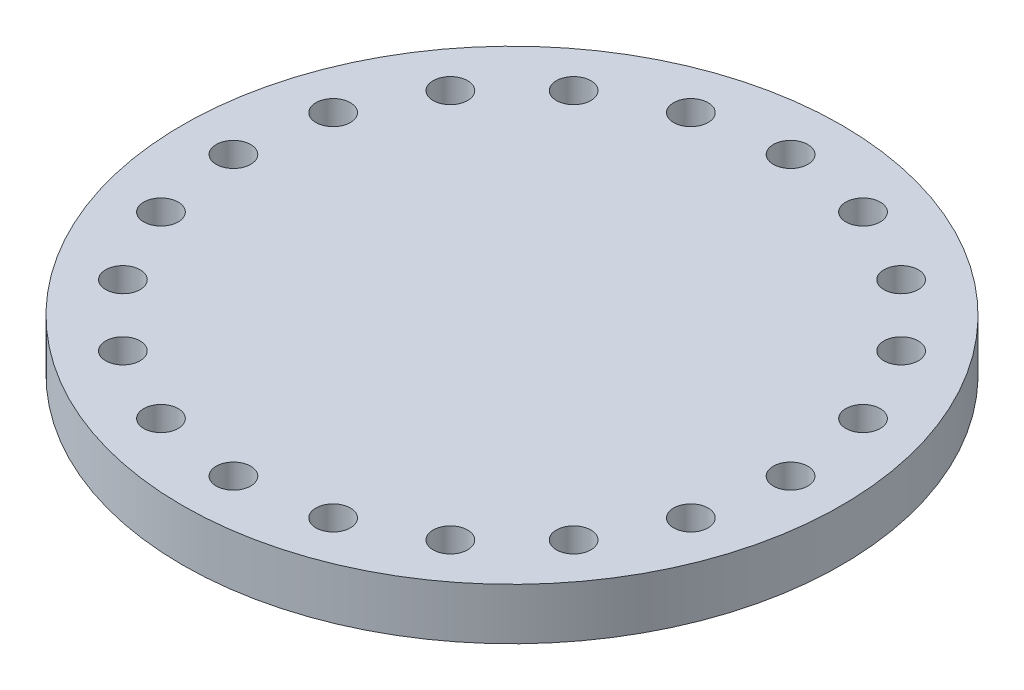
ISO-10303-21;
HEADER;
FILE_DESCRIPTION(('STEP AP214'),'2;1');
FILE_NAME('part.step','',(''),(''),'','','');
FILE_SCHEMA(('AUTOMOTIVE_DESIGN { 1 0 10303 214 1 1 1 1 }'));
ENDSEC;
DATA;
#1=APPLICATION_CONTEXT('core data for automotive mechanical design processes');
#2=APPLICATION_PROTOCOL_DEFINITION('international standard','automotive_design',2000,#1);
#3=PRODUCT_CONTEXT('',#1,'mechanical');
#4=PRODUCT('Part','Part','',(#3));
#5=PRODUCT_RELATED_PRODUCT_CATEGORY('part','',(#4));
#6=PRODUCT_DEFINITION_FORMATION('','',#4);
#7=PRODUCT_DEFINITION_CONTEXT('part definition',#1,'design');
#8=PRODUCT_DEFINITION('design','',#6,#7);
#9=PRODUCT_DEFINITION_SHAPE('','',#8);
#10=(LENGTH_UNIT() NAMED_UNIT(*) SI_UNIT(.MILLI.,.METRE.));
#11=(NAMED_UNIT(*) PLANE_ANGLE_UNIT() SI_UNIT($,.RADIAN.));
#12=(NAMED_UNIT(*) SI_UNIT($,.STERADIAN.) SOLID_ANGLE_UNIT());
#13=UNCERTAINTY_MEASURE_WITH_UNIT(LENGTH_MEASURE(1.E-05),#10,'distance_accuracy_value','');
#14=(GEOMETRIC_REPRESENTATION_CONTEXT(3) GLOBAL_UNCERTAINTY_ASSIGNED_CONTEXT((#13)) GLOBAL_UNIT_ASSIGNED_CONTEXT((#10,
#11,#12)) REPRESENTATION_CONTEXT('',''));
#15=CARTESIAN_POINT('',(0.,0.,0.));
#16=DIRECTION('',(0.,0.,1.));
#17=DIRECTION('',(1.,0.,0.));
#18=AXIS2_PLACEMENT_3D('',#15,#16,#17);
#19=CARTESIAN_POINT('',(0.,5.,0.));
#20=DIRECTION('',(0.,1.,0.));
#21=DIRECTION('',(0.,0.,1.));
#22=AXIS2_PLACEMENT_3D('',#19,#20,#21);
#23=PLANE('',#22);
#24=CARTESIAN_POINT('',(15.8995910745112,5.,21.8839096978426));
#25=DIRECTION('',(0.,1.,0.));
#26=DIRECTION('',(0.,0.,1.));
#27=AXIS2_PLACEMENT_3D('',#24,#25,#26);
#28=CIRCLE('',#27,1.67500000000001);
#29=CARTESIAN_POINT('',(15.8995910745112,5.,23.5589096978426));
#30=VERTEX_POINT('',#29);
#31=EDGE_CURVE('E198',#30,#30,#28,.T.);
#32=ORIENTED_EDGE('',*,*,#31,.F.);
#33=EDGE_LOOP('',(#32));
#34=FACE_BOUND('',#33,.T.);
#35=CARTESIAN_POINT('',(25.7260787657839,5.,8.35890969784265));
#36=DIRECTION('',(0.,1.,0.));
#37=DIRECTION('',(0.,0.,1.));
#38=AXIS2_PLACEMENT_3D('',#35,#36,#37);
#39=CIRCLE('',#38,1.67500000000001);
#40=CARTESIAN_POINT('',(25.7260787657839,5.,10.0339096978427));
#41=VERTEX_POINT('',#40);
#42=EDGE_CURVE('E182',#41,#41,#39,.T.);
#43=ORIENTED_EDGE('',*,*,#42,.F.);
#44=EDGE_LOOP('',(#43));
#45=FACE_BOUND('',#44,.T.);
#46=CARTESIAN_POINT('',(25.7260787657841,5.,-8.35890969784211));
#47=DIRECTION('',(0.,1.,0.));
#48=DIRECTION('',(0.,0.,1.));
#49=AXIS2_PLACEMENT_3D('',#46,#47,#48);
#50=CIRCLE('',#49,1.67500000000001);
#51=CARTESIAN_POINT('',(25.7260787657841,5.,-6.6839096978421));
#52=VERTEX_POINT('',#51);
#53=EDGE_CURVE('E166',#52,#52,#50,.T.);
#54=ORIENTED_EDGE('',*,*,#53,.F.);
#55=EDGE_LOOP('',(#54));
#56=FACE_BOUND('',#55,.T.);
#57=CARTESIAN_POINT('',(15.8995910745117,5.,-21.8839096978423));
#58=DIRECTION('',(0.,1.,0.));
#59=DIRECTION('',(0.,0.,1.));
#60=AXIS2_PLACEMENT_3D('',#57,#58,#59);
#61=CIRCLE('',#60,1.67500000000001);
#62=CARTESIAN_POINT('',(15.8995910745117,5.,-20.2089096978423));
#63=VERTEX_POINT('',#62);
#64=EDGE_CURVE('E150',#63,#63,#61,.T.);
#65=ORIENTED_EDGE('',*,*,#64,.F.);
#66=EDGE_LOOP('',(#65));
#67=FACE_BOUND('',#66,.T.);
#68=CARTESIAN_POINT('',(1.88889140431414E-13,5.,-27.0500000000001));
#69=DIRECTION('',(0.,1.,0.));
#70=DIRECTION('',(0.,0.,1.));
#71=AXIS2_PLACEMENT_3D('',#68,#69,#70);
#72=CIRCLE('',#71,1.67500000000001);
#73=CARTESIAN_POINT('',(1.88889140431414E-13,5.,-25.3750000000001));
#74=VERTEX_POINT('',#73);
#75=EDGE_CURVE('E134',#74,#74,#72,.T.);
#76=ORIENTED_EDGE('',*,*,#75,.F.);
#77=EDGE_LOOP('',(#76));
#78=FACE_BOUND('',#77,.T.);
#79=CARTESIAN_POINT('',(-15.8995910745113,5.,-21.8839096978425));
#80=DIRECTION('',(0.,1.,0.));
#81=DIRECTION('',(0.,0.,1.));
#82=AXIS2_PLACEMENT_3D('',#79,#80,#81);
#83=CIRCLE('',#82,1.67500000000001);
#84=CARTESIAN_POINT('',(-15.8995910745113,5.,-20.2089096978425));
#85=VERTEX_POINT('',#84);
#86=EDGE_CURVE('E118',#85,#85,#83,.T.);
#87=ORIENTED_EDGE('',*,*,#86,.F.);
#88=EDGE_LOOP('',(#87));
#89=FACE_BOUND('',#88,.T.);
#90=CARTESIAN_POINT('',(-25.726078765784,5.,-8.35890969784247));
#91=DIRECTION('',(0.,1.,0.));
#92=DIRECTION('',(0.,0.,1.));
#93=AXIS2_PLACEMENT_3D('',#90,#91,#92);
#94=CIRCLE('',#93,1.67500000000001);
#95=CARTESIAN_POINT('',(-25.726078765784,5.,-6.68390969784246));
#96=VERTEX_POINT('',#95);
#97=EDGE_CURVE('E102',#96,#96,#94,.T.);
#98=ORIENTED_EDGE('',*,*,#97,.F.);
#99=EDGE_LOOP('',(#98));
#100=FACE_BOUND('',#99,.T.);
#101=CARTESIAN_POINT('',(0.,5.,27.0500000000001));
#102=DIRECTION('',(0.,1.,0.));
#103=DIRECTION('',(0.,0.,1.));
#104=AXIS2_PLACEMENT_3D('',#101,#102,#103);
#105=CIRCLE('',#104,1.67500000000001);
#106=CARTESIAN_POINT('',(0.,5.,28.7250000000001));
#107=VERTEX_POINT('',#106);
#108=EDGE_CURVE('E86',#107,#107,#105,.T.);
#109=ORIENTED_EDGE('',*,*,#108,.F.);
#110=EDGE_LOOP('',(#109));
#111=FACE_BOUND('',#110,.T.);
#112=CARTESIAN_POINT('',(-21.8839096978424,5.,15.8995910745114));
#113=DIRECTION('',(0.,1.,0.));
#114=DIRECTION('',(0.,0.,1.));
#115=AXIS2_PLACEMENT_3D('',#112,#113,#114);
#116=CIRCLE('',#115,1.67500000000002);
#117=CARTESIAN_POINT('',(-21.8839096978424,5.,17.5745910745114));
#118=VERTEX_POINT('',#117);
#119=EDGE_CURVE('E70',#118,#118,#116,.T.);
#120=ORIENTED_EDGE('',*,*,#119,.F.);
#121=EDGE_LOOP('',(#120));
#122=FACE_BOUND('',#121,.T.);
#123=CARTESIAN_POINT('',(-8.35890969784238,5.,25.726078765784));
#124=DIRECTION('',(0.,1.,0.));
#125=DIRECTION('',(0.,0.,1.));
#126=AXIS2_PLACEMENT_3D('',#123,#124,#125);
#127=CIRCLE('',#126,1.67500000000001);
#128=CARTESIAN_POINT('',(-8.35890969784238,5.,27.401078765784));
#129=VERTEX_POINT('',#128);
#130=EDGE_CURVE('E56',#129,#129,#127,.T.);
#131=ORIENTED_EDGE('',*,*,#130,.F.);
#132=EDGE_LOOP('',(#131));
#133=FACE_BOUND('',#132,.T.);
#134=CARTESIAN_POINT('',(0.,5.,0.));
#135=DIRECTION('',(0.,1.,0.));
#136=DIRECTION('',(0.,0.,1.));
#137=AXIS2_PLACEMENT_3D('',#134,#135,#136);
#138=CIRCLE('',#137,32.);
#139=CARTESIAN_POINT('',(0.,5.,32.));
#140=VERTEX_POINT('',#139);
#141=EDGE_CURVE('E10',#140,#140,#138,.T.);
#142=ORIENTED_EDGE('',*,*,#141,.T.);
#143=EDGE_LOOP('',(#142));
#144=FACE_BOUND('',#143,.T.);
#145=CARTESIAN_POINT('',(-15.8995910745115,5.,21.8839096978424));
#146=DIRECTION('',(0.,1.,0.));
#147=DIRECTION('',(0.,0.,1.));
#148=AXIS2_PLACEMENT_3D('',#145,#146,#147);
#149=CIRCLE('',#148,1.67500000000001);
#150=CARTESIAN_POINT('',(-15.8995910745115,5.,23.5589096978424));
#151=VERTEX_POINT('',#150);
#152=EDGE_CURVE('E62',#151,#151,#149,.T.);
#153=ORIENTED_EDGE('',*,*,#152,.F.);
#154=EDGE_LOOP('',(#153));
#155=FACE_BOUND('',#154,.T.);
#156=CARTESIAN_POINT('',(-25.726078765784,5.,8.35890969784229));
#157=DIRECTION('',(0.,1.,0.));
#158=DIRECTION('',(0.,0.,1.));
#159=AXIS2_PLACEMENT_3D('',#156,#157,#158);
#160=CIRCLE('',#159,1.67500000000001);
#161=CARTESIAN_POINT('',(-25.726078765784,5.,10.0339096978423));
#162=VERTEX_POINT('',#161);
#163=EDGE_CURVE('E78',#162,#162,#160,.T.);
#164=ORIENTED_EDGE('',*,*,#163,.F.);
#165=EDGE_LOOP('',(#164));
#166=FACE_BOUND('',#165,.T.);
#167=CARTESIAN_POINT('',(-27.0500000000001,5.,0.));
#168=DIRECTION('',(0.,1.,0.));
#169=DIRECTION('',(0.,0.,1.));
#170=AXIS2_PLACEMENT_3D('',#167,#168,#169);
#171=CIRCLE('',#170,1.67500000000001);
#172=CARTESIAN_POINT('',(-27.0500000000001,5.,1.67499999999992));
#173=VERTEX_POINT('',#172);
#174=EDGE_CURVE('E94',#173,#173,#171,.T.);
#175=ORIENTED_EDGE('',*,*,#174,.F.);
#176=EDGE_LOOP('',(#175));
#177=FACE_BOUND('',#176,.T.);
#178=CARTESIAN_POINT('',(-21.8839096978423,5.,-15.8995910745116));
#179=DIRECTION('',(0.,1.,0.));
#180=DIRECTION('',(0.,0.,1.));
#181=AXIS2_PLACEMENT_3D('',#178,#179,#180);
#182=CIRCLE('',#181,1.67500000000001);
#183=CARTESIAN_POINT('',(-21.8839096978423,5.,-14.2245910745115));
#184=VERTEX_POINT('',#183);
#185=EDGE_CURVE('E110',#184,#184,#182,.T.);
#186=ORIENTED_EDGE('',*,*,#185,.F.);
#187=EDGE_LOOP('',(#186));
#188=FACE_BOUND('',#187,.T.);
#189=CARTESIAN_POINT('',(-8.35890969784219,5.,-25.726078765784));
#190=DIRECTION('',(0.,1.,0.));
#191=DIRECTION('',(0.,0.,1.));
#192=AXIS2_PLACEMENT_3D('',#189,#190,#191);
#193=CIRCLE('',#192,1.67500000000001);
#194=CARTESIAN_POINT('',(-8.35890969784219,5.,-24.051078765784));
#195=VERTEX_POINT('',#194);
#196=EDGE_CURVE('E126',#195,#195,#193,.T.);
#197=ORIENTED_EDGE('',*,*,#196,.F.);
#198=EDGE_LOOP('',(#197));
#199=FACE_BOUND('',#198,.T.);
#200=CARTESIAN_POINT('',(8.35890969784256,5.,-25.7260787657839));
#201=DIRECTION('',(0.,1.,0.));
#202=DIRECTION('',(0.,0.,1.));
#203=AXIS2_PLACEMENT_3D('',#200,#201,#202);
#204=CIRCLE('',#203,1.67500000000001);
#205=CARTESIAN_POINT('',(8.35890969784256,5.,-24.0510787657839));
#206=VERTEX_POINT('',#205);
#207=EDGE_CURVE('E142',#206,#206,#204,.T.);
#208=ORIENTED_EDGE('',*,*,#207,.F.);
#209=EDGE_LOOP('',(#208));
#210=FACE_BOUND('',#209,.T.);
#211=CARTESIAN_POINT('',(21.8839096978426,5.,-15.8995910745112));
#212=DIRECTION('',(0.,1.,0.));
#213=DIRECTION('',(0.,0.,1.));
#214=AXIS2_PLACEMENT_3D('',#211,#212,#213);
#215=CIRCLE('',#214,1.67500000000001);
#216=CARTESIAN_POINT('',(21.8839096978426,5.,-14.2245910745112));
#217=VERTEX_POINT('',#216);
#218=EDGE_CURVE('E158',#217,#217,#215,.T.);
#219=ORIENTED_EDGE('',*,*,#218,.F.);
#220=EDGE_LOOP('',(#219));
#221=FACE_BOUND('',#220,.T.);
#222=CARTESIAN_POINT('',(27.0500000000001,5.,2.83333710647121E-13));
#223=DIRECTION('',(0.,1.,0.));
#224=DIRECTION('',(0.,0.,1.));
#225=AXIS2_PLACEMENT_3D('',#222,#223,#224);
#226=CIRCLE('',#225,1.67500000000001);
#227=CARTESIAN_POINT('',(27.0500000000001,5.,1.67500000000029));
#228=VERTEX_POINT('',#227);
#229=EDGE_CURVE('E174',#228,#228,#226,.T.);
#230=ORIENTED_EDGE('',*,*,#229,.F.);
#231=EDGE_LOOP('',(#230));
#232=FACE_BOUND('',#231,.T.);
#233=CARTESIAN_POINT('',(21.8839096978422,5.,15.8995910745117));
#234=DIRECTION('',(0.,1.,0.));
#235=DIRECTION('',(0.,0.,1.));
#236=AXIS2_PLACEMENT_3D('',#233,#234,#235);
#237=CIRCLE('',#236,1.67500000000001);
#238=CARTESIAN_POINT('',(21.8839096978422,5.,17.5745910745117));
#239=VERTEX_POINT('',#238);
#240=EDGE_CURVE('E190',#239,#239,#237,.T.);
#241=ORIENTED_EDGE('',*,*,#240,.F.);
#242=EDGE_LOOP('',(#241));
#243=FACE_BOUND('',#242,.T.);
#244=CARTESIAN_POINT('',(8.35890969784202,5.,25.7260787657841));
#245=DIRECTION('',(0.,1.,0.));
#246=DIRECTION('',(0.,0.,1.));
#247=AXIS2_PLACEMENT_3D('',#244,#245,#246);
#248=CIRCLE('',#247,1.67500000000001);
#249=CARTESIAN_POINT('',(8.35890969784202,5.,27.4010787657841));
#250=VERTEX_POINT('',#249);
#251=EDGE_CURVE('E206',#250,#250,#248,.T.);
#252=ORIENTED_EDGE('',*,*,#251,.F.);
#253=EDGE_LOOP('',(#252));
#254=FACE_BOUND('',#253,.T.);
#255=ADVANCED_FACE('F43',(#34,#45,#56,#67,#78,#89,#100,#111,#122,#133,#144,#155,#166,#177,#188,
#199,#210,#221,#232,#243,#254),#23,.T.);
#256=CARTESIAN_POINT('',(0.,0.,0.));
#257=DIRECTION('',(0.,1.,0.));
#258=DIRECTION('',(0.,0.,1.));
#259=AXIS2_PLACEMENT_3D('',#256,#257,#258);
#260=PLANE('',#259);
#261=CARTESIAN_POINT('',(0.,0.,0.));
#262=DIRECTION('',(0.,1.,0.));
#263=DIRECTION('',(0.,0.,1.));
#264=AXIS2_PLACEMENT_3D('',#261,#262,#263);
#265=CIRCLE('',#264,32.);
#266=CARTESIAN_POINT('',(0.,0.,32.));
#267=VERTEX_POINT('',#266);
#268=EDGE_CURVE('E47',#267,#267,#265,.T.);
#269=ORIENTED_EDGE('',*,*,#268,.F.);
#270=EDGE_LOOP('',(#269));
#271=FACE_BOUND('',#270,.T.);
#272=CARTESIAN_POINT('',(-8.35890969784238,0.,25.726078765784));
#273=DIRECTION('',(0.,1.,0.));
#274=DIRECTION('',(0.,0.,1.));
#275=AXIS2_PLACEMENT_3D('',#272,#273,#274);
#276=CIRCLE('',#275,1.67500000000001);
#277=CARTESIAN_POINT('',(-8.35890969784238,0.,27.401078765784));
#278=VERTEX_POINT('',#277);
#279=EDGE_CURVE('E58',#278,#278,#276,.T.);
#280=ORIENTED_EDGE('',*,*,#279,.T.);
#281=EDGE_LOOP('',(#280));
#282=FACE_BOUND('',#281,.T.);
#283=CARTESIAN_POINT('',(-15.8995910745115,0.,21.8839096978424));
#284=DIRECTION('',(0.,1.,0.));
#285=DIRECTION('',(0.,0.,1.));
#286=AXIS2_PLACEMENT_3D('',#283,#284,#285);
#287=CIRCLE('',#286,1.67500000000001);
#288=CARTESIAN_POINT('',(-15.8995910745115,0.,23.5589096978424));
#289=VERTEX_POINT('',#288);
#290=EDGE_CURVE('E66',#289,#289,#287,.T.);
#291=ORIENTED_EDGE('',*,*,#290,.T.);
#292=EDGE_LOOP('',(#291));
#293=FACE_BOUND('',#292,.T.);
#294=CARTESIAN_POINT('',(-21.8839096978424,0.,15.8995910745114));
#295=DIRECTION('',(0.,1.,0.));
#296=DIRECTION('',(0.,0.,1.));
#297=AXIS2_PLACEMENT_3D('',#294,#295,#296);
#298=CIRCLE('',#297,1.67500000000002);
#299=CARTESIAN_POINT('',(-21.8839096978424,0.,17.5745910745114));
#300=VERTEX_POINT('',#299);
#301=EDGE_CURVE('E74',#300,#300,#298,.T.);
#302=ORIENTED_EDGE('',*,*,#301,.T.);
#303=EDGE_LOOP('',(#302));
#304=FACE_BOUND('',#303,.T.);
#305=CARTESIAN_POINT('',(-25.726078765784,0.,8.35890969784229));
#306=DIRECTION('',(0.,1.,0.));
#307=DIRECTION('',(0.,0.,1.));
#308=AXIS2_PLACEMENT_3D('',#305,#306,#307);
#309=CIRCLE('',#308,1.67500000000001);
#310=CARTESIAN_POINT('',(-25.726078765784,0.,10.0339096978423));
#311=VERTEX_POINT('',#310);
#312=EDGE_CURVE('E82',#311,#311,#309,.T.);
#313=ORIENTED_EDGE('',*,*,#312,.T.);
#314=EDGE_LOOP('',(#313));
#315=FACE_BOUND('',#314,.T.);
#316=CARTESIAN_POINT('',(0.,0.,27.0500000000001));
#317=DIRECTION('',(0.,1.,0.));
#318=DIRECTION('',(0.,0.,1.));
#319=AXIS2_PLACEMENT_3D('',#316,#317,#318);
#320=CIRCLE('',#319,1.67500000000001);
#321=CARTESIAN_POINT('',(0.,0.,28.7250000000001));
#322=VERTEX_POINT('',#321);
#323=EDGE_CURVE('E90',#322,#322,#320,.T.);
#324=ORIENTED_EDGE('',*,*,#323,.T.);
#325=EDGE_LOOP('',(#324));
#326=FACE_BOUND('',#325,.T.);
#327=CARTESIAN_POINT('',(-27.0500000000001,0.,0.));
#328=DIRECTION('',(0.,1.,0.));
#329=DIRECTION('',(0.,0.,1.));
#330=AXIS2_PLACEMENT_3D('',#327,#328,#329);
#331=CIRCLE('',#330,1.67500000000001);
#332=CARTESIAN_POINT('',(-27.0500000000001,0.,1.67499999999992));
#333=VERTEX_POINT('',#332);
#334=EDGE_CURVE('E98',#333,#333,#331,.T.);
#335=ORIENTED_EDGE('',*,*,#334,.T.);
#336=EDGE_LOOP('',(#335));
#337=FACE_BOUND('',#336,.T.);
#338=CARTESIAN_POINT('',(-25.726078765784,0.,-8.35890969784247));
#339=DIRECTION('',(0.,1.,0.));
#340=DIRECTION('',(0.,0.,1.));
#341=AXIS2_PLACEMENT_3D('',#338,#339,#340);
#342=CIRCLE('',#341,1.67500000000001);
#343=CARTESIAN_POINT('',(-25.726078765784,0.,-6.68390969784246));
#344=VERTEX_POINT('',#343);
#345=EDGE_CURVE('E106',#344,#344,#342,.T.);
#346=ORIENTED_EDGE('',*,*,#345,.T.);
#347=EDGE_LOOP('',(#346));
#348=FACE_BOUND('',#347,.T.);
#349=CARTESIAN_POINT('',(-21.8839096978423,0.,-15.8995910745116));
#350=DIRECTION('',(0.,1.,0.));
#351=DIRECTION('',(0.,0.,1.));
#352=AXIS2_PLACEMENT_3D('',#349,#350,#351);
#353=CIRCLE('',#352,1.67500000000001);
#354=CARTESIAN_POINT('',(-21.8839096978423,0.,-14.2245910745115));
#355=VERTEX_POINT('',#354);
#356=EDGE_CURVE('E114',#355,#355,#353,.T.);
#357=ORIENTED_EDGE('',*,*,#356,.T.);
#358=EDGE_LOOP('',(#357));
#359=FACE_BOUND('',#358,.T.);
#360=CARTESIAN_POINT('',(-15.8995910745113,0.,-21.8839096978425));
#361=DIRECTION('',(0.,1.,0.));
#362=DIRECTION('',(0.,0.,1.));
#363=AXIS2_PLACEMENT_3D('',#360,#361,#362);
#364=CIRCLE('',#363,1.67500000000001);
#365=CARTESIAN_POINT('',(-15.8995910745113,0.,-20.2089096978425));
#366=VERTEX_POINT('',#365);
#367=EDGE_CURVE('E122',#366,#366,#364,.T.);
#368=ORIENTED_EDGE('',*,*,#367,.T.);
#369=EDGE_LOOP('',(#368));
#370=FACE_BOUND('',#369,.T.);
#371=CARTESIAN_POINT('',(-8.35890969784219,0.,-25.726078765784));
#372=DIRECTION('',(0.,1.,0.));
#373=DIRECTION('',(0.,0.,1.));
#374=AXIS2_PLACEMENT_3D('',#371,#372,#373);
#375=CIRCLE('',#374,1.67500000000001);
#376=CARTESIAN_POINT('',(-8.35890969784219,0.,-24.051078765784));
#377=VERTEX_POINT('',#376);
#378=EDGE_CURVE('E130',#377,#377,#375,.T.);
#379=ORIENTED_EDGE('',*,*,#378,.T.);
#380=EDGE_LOOP('',(#379));
#381=FACE_BOUND('',#380,.T.);
#382=CARTESIAN_POINT('',(1.88889140431414E-13,0.,-27.0500000000001));
#383=DIRECTION('',(0.,1.,0.));
#384=DIRECTION('',(0.,0.,1.));
#385=AXIS2_PLACEMENT_3D('',#382,#383,#384);
#386=CIRCLE('',#385,1.67500000000001);
#387=CARTESIAN_POINT('',(1.88889140431414E-13,0.,-25.3750000000001));
#388=VERTEX_POINT('',#387);
#389=EDGE_CURVE('E138',#388,#388,#386,.T.);
#390=ORIENTED_EDGE('',*,*,#389,.T.);
#391=EDGE_LOOP('',(#390));
#392=FACE_BOUND('',#391,.T.);
#393=CARTESIAN_POINT('',(8.35890969784256,0.,-25.7260787657839));
#394=DIRECTION('',(0.,1.,0.));
#395=DIRECTION('',(0.,0.,1.));
#396=AXIS2_PLACEMENT_3D('',#393,#394,#395);
#397=CIRCLE('',#396,1.67500000000001);
#398=CARTESIAN_POINT('',(8.35890969784256,0.,-24.0510787657839));
#399=VERTEX_POINT('',#398);
#400=EDGE_CURVE('E146',#399,#399,#397,.T.);
#401=ORIENTED_EDGE('',*,*,#400,.T.);
#402=EDGE_LOOP('',(#401));
#403=FACE_BOUND('',#402,.T.);
#404=CARTESIAN_POINT('',(15.8995910745117,0.,-21.8839096978423));
#405=DIRECTION('',(0.,1.,0.));
#406=DIRECTION('',(0.,0.,1.));
#407=AXIS2_PLACEMENT_3D('',#404,#405,#406);
#408=CIRCLE('',#407,1.67500000000001);
#409=CARTESIAN_POINT('',(15.8995910745117,0.,-20.2089096978423));
#410=VERTEX_POINT('',#409);
#411=EDGE_CURVE('E154',#410,#410,#408,.T.);
#412=ORIENTED_EDGE('',*,*,#411,.T.);
#413=EDGE_LOOP('',(#412));
#414=FACE_BOUND('',#413,.T.);
#415=CARTESIAN_POINT('',(21.8839096978426,0.,-15.8995910745112));
#416=DIRECTION('',(0.,1.,0.));
#417=DIRECTION('',(0.,0.,1.));
#418=AXIS2_PLACEMENT_3D('',#415,#416,#417);
#419=CIRCLE('',#418,1.67500000000001);
#420=CARTESIAN_POINT('',(21.8839096978426,0.,-14.2245910745112));
#421=VERTEX_POINT('',#420);
#422=EDGE_CURVE('E162',#421,#421,#419,.T.);
#423=ORIENTED_EDGE('',*,*,#422,.T.);
#424=EDGE_LOOP('',(#423));
#425=FACE_BOUND('',#424,.T.);
#426=CARTESIAN_POINT('',(25.7260787657841,0.,-8.35890969784211));
#427=DIRECTION('',(0.,1.,0.));
#428=DIRECTION('',(0.,0.,1.));
#429=AXIS2_PLACEMENT_3D('',#426,#427,#428);
#430=CIRCLE('',#429,1.67500000000001);
#431=CARTESIAN_POINT('',(25.7260787657841,0.,-6.6839096978421));
#432=VERTEX_POINT('',#431);
#433=EDGE_CURVE('E170',#432,#432,#430,.T.);
#434=ORIENTED_EDGE('',*,*,#433,.T.);
#435=EDGE_LOOP('',(#434));
#436=FACE_BOUND('',#435,.T.);
#437=CARTESIAN_POINT('',(27.0500000000001,0.,2.83333710647121E-13));
#438=DIRECTION('',(0.,1.,0.));
#439=DIRECTION('',(0.,0.,1.));
#440=AXIS2_PLACEMENT_3D('',#437,#438,#439);
#441=CIRCLE('',#440,1.67500000000001);
#442=CARTESIAN_POINT('',(27.0500000000001,0.,1.67500000000029));
#443=VERTEX_POINT('',#442);
#444=EDGE_CURVE('E178',#443,#443,#441,.T.);
#445=ORIENTED_EDGE('',*,*,#444,.T.);
#446=EDGE_LOOP('',(#445));
#447=FACE_BOUND('',#446,.T.);
#448=CARTESIAN_POINT('',(25.7260787657839,0.,8.35890969784265));
#449=DIRECTION('',(0.,1.,0.));
#450=DIRECTION('',(0.,0.,1.));
#451=AXIS2_PLACEMENT_3D('',#448,#449,#450);
#452=CIRCLE('',#451,1.67500000000001);
#453=CARTESIAN_POINT('',(25.7260787657839,0.,10.0339096978427));
#454=VERTEX_POINT('',#453);
#455=EDGE_CURVE('E186',#454,#454,#452,.T.);
#456=ORIENTED_EDGE('',*,*,#455,.T.);
#457=EDGE_LOOP('',(#456));
#458=FACE_BOUND('',#457,.T.);
#459=CARTESIAN_POINT('',(21.8839096978422,0.,15.8995910745117));
#460=DIRECTION('',(0.,1.,0.));
#461=DIRECTION('',(0.,0.,1.));
#462=AXIS2_PLACEMENT_3D('',#459,#460,#461);
#463=CIRCLE('',#462,1.67500000000001);
#464=CARTESIAN_POINT('',(21.8839096978422,0.,17.5745910745117));
#465=VERTEX_POINT('',#464);
#466=EDGE_CURVE('E194',#465,#465,#463,.T.);
#467=ORIENTED_EDGE('',*,*,#466,.T.);
#468=EDGE_LOOP('',(#467));
#469=FACE_BOUND('',#468,.T.);
#470=CARTESIAN_POINT('',(15.8995910745112,0.,21.8839096978426));
#471=DIRECTION('',(0.,1.,0.));
#472=DIRECTION('',(0.,0.,1.));
#473=AXIS2_PLACEMENT_3D('',#470,#471,#472);
#474=CIRCLE('',#473,1.67500000000001);
#475=CARTESIAN_POINT('',(15.8995910745112,0.,23.5589096978426));
#476=VERTEX_POINT('',#475);
#477=EDGE_CURVE('E202',#476,#476,#474,.T.);
#478=ORIENTED_EDGE('',*,*,#477,.T.);
#479=EDGE_LOOP('',(#478));
#480=FACE_BOUND('',#479,.T.);
#481=CARTESIAN_POINT('',(8.35890969784202,0.,25.7260787657841));
#482=DIRECTION('',(0.,1.,0.));
#483=DIRECTION('',(0.,0.,1.));
#484=AXIS2_PLACEMENT_3D('',#481,#482,#483);
#485=CIRCLE('',#484,1.67500000000001);
#486=CARTESIAN_POINT('',(8.35890969784202,0.,27.4010787657841));
#487=VERTEX_POINT('',#486);
#488=EDGE_CURVE('E210',#487,#487,#485,.T.);
#489=ORIENTED_EDGE('',*,*,#488,.T.);
#490=EDGE_LOOP('',(#489));
#491=FACE_BOUND('',#490,.T.);
#492=ADVANCED_FACE('F222',(#271,#282,#293,#304,#315,#326,#337,#348,#359,#370,#381,#392,#403,
#414,#425,#436,#447,#458,#469,#480,#491),#260,.F.);
#493=CARTESIAN_POINT('',(0.,5.,0.));
#494=DIRECTION('',(0.,-1.,0.));
#495=DIRECTION('',(0.,0.,-1.));
#496=AXIS2_PLACEMENT_3D('',#493,#494,#495);
#497=CYLINDRICAL_SURFACE('',#496,32.);
#498=ORIENTED_EDGE('',*,*,#141,.F.);
#499=EDGE_LOOP('',(#498));
#500=FACE_BOUND('',#499,.T.);
#501=ORIENTED_EDGE('',*,*,#268,.T.);
#502=EDGE_LOOP('',(#501));
#503=FACE_BOUND('',#502,.T.);
#504=ADVANCED_FACE('F45',(#500,#503),#497,.T.);
#505=CARTESIAN_POINT('',(-8.35890969784238,5.,25.726078765784));
#506=DIRECTION('',(0.,-1.,0.));
#507=DIRECTION('',(0.,0.,-1.));
#508=AXIS2_PLACEMENT_3D('',#505,#506,#507);
#509=CYLINDRICAL_SURFACE('',#508,1.67500000000001);
#510=ORIENTED_EDGE('',*,*,#130,.T.);
#511=EDGE_LOOP('',(#510));
#512=FACE_BOUND('',#511,.T.);
#513=ORIENTED_EDGE('',*,*,#279,.F.);
#514=EDGE_LOOP('',(#513));
#515=FACE_BOUND('',#514,.T.);
#516=ADVANCED_FACE('F232',(#512,#515),#509,.F.);
#517=CARTESIAN_POINT('',(-15.8995910745115,5.,21.8839096978424));
#518=DIRECTION('',(0.,-1.,0.));
#519=DIRECTION('',(0.,0.,-1.));
#520=AXIS2_PLACEMENT_3D('',#517,#518,#519);
#521=CYLINDRICAL_SURFACE('',#520,1.67500000000001);
#522=ORIENTED_EDGE('',*,*,#152,.T.);
#523=EDGE_LOOP('',(#522));
#524=FACE_BOUND('',#523,.T.);
#525=ORIENTED_EDGE('',*,*,#290,.F.);
#526=EDGE_LOOP('',(#525));
#527=FACE_BOUND('',#526,.T.);
#528=ADVANCED_FACE('F235',(#524,#527),#521,.F.);
#529=CARTESIAN_POINT('',(-21.8839096978424,5.,15.8995910745114));
#530=DIRECTION('',(0.,-1.,0.));
#531=DIRECTION('',(0.,0.,-1.));
#532=AXIS2_PLACEMENT_3D('',#529,#530,#531);
#533=CYLINDRICAL_SURFACE('',#532,1.67500000000002);
#534=ORIENTED_EDGE('',*,*,#119,.T.);
#535=EDGE_LOOP('',(#534));
#536=FACE_BOUND('',#535,.T.);
#537=ORIENTED_EDGE('',*,*,#301,.F.);
#538=EDGE_LOOP('',(#537));
#539=FACE_BOUND('',#538,.T.);
#540=ADVANCED_FACE('F239',(#536,#539),#533,.F.);
#541=CARTESIAN_POINT('',(-25.726078765784,5.,8.35890969784229));
#542=DIRECTION('',(0.,-1.,0.));
#543=DIRECTION('',(0.,0.,-1.));
#544=AXIS2_PLACEMENT_3D('',#541,#542,#543);
#545=CYLINDRICAL_SURFACE('',#544,1.67500000000001);
#546=ORIENTED_EDGE('',*,*,#163,.T.);
#547=EDGE_LOOP('',(#546));
#548=FACE_BOUND('',#547,.T.);
#549=ORIENTED_EDGE('',*,*,#312,.F.);
#550=EDGE_LOOP('',(#549));
#551=FACE_BOUND('',#550,.T.);
#552=ADVANCED_FACE('F243',(#548,#551),#545,.F.);
#553=CARTESIAN_POINT('',(0.,5.,27.0500000000001));
#554=DIRECTION('',(0.,-1.,0.));
#555=DIRECTION('',(0.,0.,-1.));
#556=AXIS2_PLACEMENT_3D('',#553,#554,#555);
#557=CYLINDRICAL_SURFACE('',#556,1.67500000000001);
#558=ORIENTED_EDGE('',*,*,#108,.T.);
#559=EDGE_LOOP('',(#558));
#560=FACE_BOUND('',#559,.T.);
#561=ORIENTED_EDGE('',*,*,#323,.F.);
#562=EDGE_LOOP('',(#561));
#563=FACE_BOUND('',#562,.T.);
#564=ADVANCED_FACE('F247',(#560,#563),#557,.F.);
#565=CARTESIAN_POINT('',(-27.0500000000001,5.,0.));
#566=DIRECTION('',(0.,-1.,0.));
#567=DIRECTION('',(0.,0.,-1.));
#568=AXIS2_PLACEMENT_3D('',#565,#566,#567);
#569=CYLINDRICAL_SURFACE('',#568,1.67500000000001);
#570=ORIENTED_EDGE('',*,*,#174,.T.);
#571=EDGE_LOOP('',(#570));
#572=FACE_BOUND('',#571,.T.);
#573=ORIENTED_EDGE('',*,*,#334,.F.);
#574=EDGE_LOOP('',(#573));
#575=FACE_BOUND('',#574,.T.);
#576=ADVANCED_FACE('F251',(#572,#575),#569,.F.);
#577=CARTESIAN_POINT('',(-25.726078765784,5.,-8.35890969784247));
#578=DIRECTION('',(0.,-1.,0.));
#579=DIRECTION('',(0.,0.,-1.));
#580=AXIS2_PLACEMENT_3D('',#577,#578,#579);
#581=CYLINDRICAL_SURFACE('',#580,1.67500000000001);
#582=ORIENTED_EDGE('',*,*,#97,.T.);
#583=EDGE_LOOP('',(#582));
#584=FACE_BOUND('',#583,.T.);
#585=ORIENTED_EDGE('',*,*,#345,.F.);
#586=EDGE_LOOP('',(#585));
#587=FACE_BOUND('',#586,.T.);
#588=ADVANCED_FACE('F255',(#584,#587),#581,.F.);
#589=CARTESIAN_POINT('',(-21.8839096978423,5.,-15.8995910745116));
#590=DIRECTION('',(0.,-1.,0.));
#591=DIRECTION('',(0.,0.,-1.));
#592=AXIS2_PLACEMENT_3D('',#589,#590,#591);
#593=CYLINDRICAL_SURFACE('',#592,1.67500000000001);
#594=ORIENTED_EDGE('',*,*,#185,.T.);
#595=EDGE_LOOP('',(#594));
#596=FACE_BOUND('',#595,.T.);
#597=ORIENTED_EDGE('',*,*,#356,.F.);
#598=EDGE_LOOP('',(#597));
#599=FACE_BOUND('',#598,.T.);
#600=ADVANCED_FACE('F259',(#596,#599),#593,.F.);
#601=CARTESIAN_POINT('',(-15.8995910745113,5.,-21.8839096978425));
#602=DIRECTION('',(0.,-1.,0.));
#603=DIRECTION('',(0.,0.,-1.));
#604=AXIS2_PLACEMENT_3D('',#601,#602,#603);
#605=CYLINDRICAL_SURFACE('',#604,1.67500000000001);
#606=ORIENTED_EDGE('',*,*,#86,.T.);
#607=EDGE_LOOP('',(#606));
#608=FACE_BOUND('',#607,.T.);
#609=ORIENTED_EDGE('',*,*,#367,.F.);
#610=EDGE_LOOP('',(#609));
#611=FACE_BOUND('',#610,.T.);
#612=ADVANCED_FACE('F263',(#608,#611),#605,.F.);
#613=CARTESIAN_POINT('',(-8.35890969784219,5.,-25.726078765784));
#614=DIRECTION('',(0.,-1.,0.));
#615=DIRECTION('',(0.,0.,-1.));
#616=AXIS2_PLACEMENT_3D('',#613,#614,#615);
#617=CYLINDRICAL_SURFACE('',#616,1.67500000000001);
#618=ORIENTED_EDGE('',*,*,#196,.T.);
#619=EDGE_LOOP('',(#618));
#620=FACE_BOUND('',#619,.T.);
#621=ORIENTED_EDGE('',*,*,#378,.F.);
#622=EDGE_LOOP('',(#621));
#623=FACE_BOUND('',#622,.T.);
#624=ADVANCED_FACE('F267',(#620,#623),#617,.F.);
#625=CARTESIAN_POINT('',(1.88889140431414E-13,5.,-27.0500000000001));
#626=DIRECTION('',(0.,-1.,0.));
#627=DIRECTION('',(0.,0.,-1.));
#628=AXIS2_PLACEMENT_3D('',#625,#626,#627);
#629=CYLINDRICAL_SURFACE('',#628,1.67500000000001);
#630=ORIENTED_EDGE('',*,*,#75,.T.);
#631=EDGE_LOOP('',(#630));
#632=FACE_BOUND('',#631,.T.);
#633=ORIENTED_EDGE('',*,*,#389,.F.);
#634=EDGE_LOOP('',(#633));
#635=FACE_BOUND('',#634,.T.);
#636=ADVANCED_FACE('F271',(#632,#635),#629,.F.);
#637=CARTESIAN_POINT('',(8.35890969784256,5.,-25.7260787657839));
#638=DIRECTION('',(0.,-1.,0.));
#639=DIRECTION('',(0.,0.,-1.));
#640=AXIS2_PLACEMENT_3D('',#637,#638,#639);
#641=CYLINDRICAL_SURFACE('',#640,1.67500000000001);
#642=ORIENTED_EDGE('',*,*,#207,.T.);
#643=EDGE_LOOP('',(#642));
#644=FACE_BOUND('',#643,.T.);
#645=ORIENTED_EDGE('',*,*,#400,.F.);
#646=EDGE_LOOP('',(#645));
#647=FACE_BOUND('',#646,.T.);
#648=ADVANCED_FACE('F275',(#644,#647),#641,.F.);
#649=CARTESIAN_POINT('',(15.8995910745117,5.,-21.8839096978423));
#650=DIRECTION('',(0.,-1.,0.));
#651=DIRECTION('',(0.,0.,-1.));
#652=AXIS2_PLACEMENT_3D('',#649,#650,#651);
#653=CYLINDRICAL_SURFACE('',#652,1.67500000000001);
#654=ORIENTED_EDGE('',*,*,#64,.T.);
#655=EDGE_LOOP('',(#654));
#656=FACE_BOUND('',#655,.T.);
#657=ORIENTED_EDGE('',*,*,#411,.F.);
#658=EDGE_LOOP('',(#657));
#659=FACE_BOUND('',#658,.T.);
#660=ADVANCED_FACE('F279',(#656,#659),#653,.F.);
#661=CARTESIAN_POINT('',(21.8839096978426,5.,-15.8995910745112));
#662=DIRECTION('',(0.,-1.,0.));
#663=DIRECTION('',(0.,0.,-1.));
#664=AXIS2_PLACEMENT_3D('',#661,#662,#663);
#665=CYLINDRICAL_SURFACE('',#664,1.67500000000001);
#666=ORIENTED_EDGE('',*,*,#218,.T.);
#667=EDGE_LOOP('',(#666));
#668=FACE_BOUND('',#667,.T.);
#669=ORIENTED_EDGE('',*,*,#422,.F.);
#670=EDGE_LOOP('',(#669));
#671=FACE_BOUND('',#670,.T.);
#672=ADVANCED_FACE('F283',(#668,#671),#665,.F.);
#673=CARTESIAN_POINT('',(25.7260787657841,5.,-8.35890969784211));
#674=DIRECTION('',(0.,-1.,0.));
#675=DIRECTION('',(0.,0.,-1.));
#676=AXIS2_PLACEMENT_3D('',#673,#674,#675);
#677=CYLINDRICAL_SURFACE('',#676,1.67500000000001);
#678=ORIENTED_EDGE('',*,*,#53,.T.);
#679=EDGE_LOOP('',(#678));
#680=FACE_BOUND('',#679,.T.);
#681=ORIENTED_EDGE('',*,*,#433,.F.);
#682=EDGE_LOOP('',(#681));
#683=FACE_BOUND('',#682,.T.);
#684=ADVANCED_FACE('F287',(#680,#683),#677,.F.);
#685=CARTESIAN_POINT('',(27.0500000000001,5.,2.83333710647121E-13));
#686=DIRECTION('',(0.,-1.,0.));
#687=DIRECTION('',(0.,0.,-1.));
#688=AXIS2_PLACEMENT_3D('',#685,#686,#687);
#689=CYLINDRICAL_SURFACE('',#688,1.67500000000001);
#690=ORIENTED_EDGE('',*,*,#229,.T.);
#691=EDGE_LOOP('',(#690));
#692=FACE_BOUND('',#691,.T.);
#693=ORIENTED_EDGE('',*,*,#444,.F.);
#694=EDGE_LOOP('',(#693));
#695=FACE_BOUND('',#694,.T.);
#696=ADVANCED_FACE('F291',(#692,#695),#689,.F.);
#697=CARTESIAN_POINT('',(25.7260787657839,5.,8.35890969784265));
#698=DIRECTION('',(0.,-1.,0.));
#699=DIRECTION('',(0.,0.,-1.));
#700=AXIS2_PLACEMENT_3D('',#697,#698,#699);
#701=CYLINDRICAL_SURFACE('',#700,1.67500000000001);
#702=ORIENTED_EDGE('',*,*,#42,.T.);
#703=EDGE_LOOP('',(#702));
#704=FACE_BOUND('',#703,.T.);
#705=ORIENTED_EDGE('',*,*,#455,.F.);
#706=EDGE_LOOP('',(#705));
#707=FACE_BOUND('',#706,.T.);
#708=ADVANCED_FACE('F295',(#704,#707),#701,.F.);
#709=CARTESIAN_POINT('',(21.8839096978422,5.,15.8995910745117));
#710=DIRECTION('',(0.,-1.,0.));
#711=DIRECTION('',(0.,0.,-1.));
#712=AXIS2_PLACEMENT_3D('',#709,#710,#711);
#713=CYLINDRICAL_SURFACE('',#712,1.67500000000001);
#714=ORIENTED_EDGE('',*,*,#240,.T.);
#715=EDGE_LOOP('',(#714));
#716=FACE_BOUND('',#715,.T.);
#717=ORIENTED_EDGE('',*,*,#466,.F.);
#718=EDGE_LOOP('',(#717));
#719=FACE_BOUND('',#718,.T.);
#720=ADVANCED_FACE('F299',(#716,#719),#713,.F.);
#721=CARTESIAN_POINT('',(15.8995910745112,5.,21.8839096978426));
#722=DIRECTION('',(0.,-1.,0.));
#723=DIRECTION('',(0.,0.,-1.));
#724=AXIS2_PLACEMENT_3D('',#721,#722,#723);
#725=CYLINDRICAL_SURFACE('',#724,1.67500000000001);
#726=ORIENTED_EDGE('',*,*,#31,.T.);
#727=EDGE_LOOP('',(#726));
#728=FACE_BOUND('',#727,.T.);
#729=ORIENTED_EDGE('',*,*,#477,.F.);
#730=EDGE_LOOP('',(#729));
#731=FACE_BOUND('',#730,.T.);
#732=ADVANCED_FACE('F303',(#728,#731),#725,.F.);
#733=CARTESIAN_POINT('',(8.35890969784202,5.,25.7260787657841));
#734=DIRECTION('',(0.,-1.,0.));
#735=DIRECTION('',(0.,0.,-1.));
#736=AXIS2_PLACEMENT_3D('',#733,#734,#735);
#737=CYLINDRICAL_SURFACE('',#736,1.67500000000001);
#738=ORIENTED_EDGE('',*,*,#251,.T.);
#739=EDGE_LOOP('',(#738));
#740=FACE_BOUND('',#739,.T.);
#741=ORIENTED_EDGE('',*,*,#488,.F.);
#742=EDGE_LOOP('',(#741));
#743=FACE_BOUND('',#742,.T.);
#744=ADVANCED_FACE('F218',(#740,#743),#737,.F.);
#745=CLOSED_SHELL('',(#255,#492,#504,#516,#528,#540,#552,#564,#576,#588,#600,#612,#624,#636,
#648,#660,#672,#684,#696,#708,#720,#732,#744));
#746=MANIFOLD_SOLID_BREP('B2',#745);
#747=ADVANCED_BREP_SHAPE_REPRESENTATION('',(#18,#746),#14);
#748=SHAPE_DEFINITION_REPRESENTATION(#9,#747);
ENDSEC;
END-ISO-10303-21;
